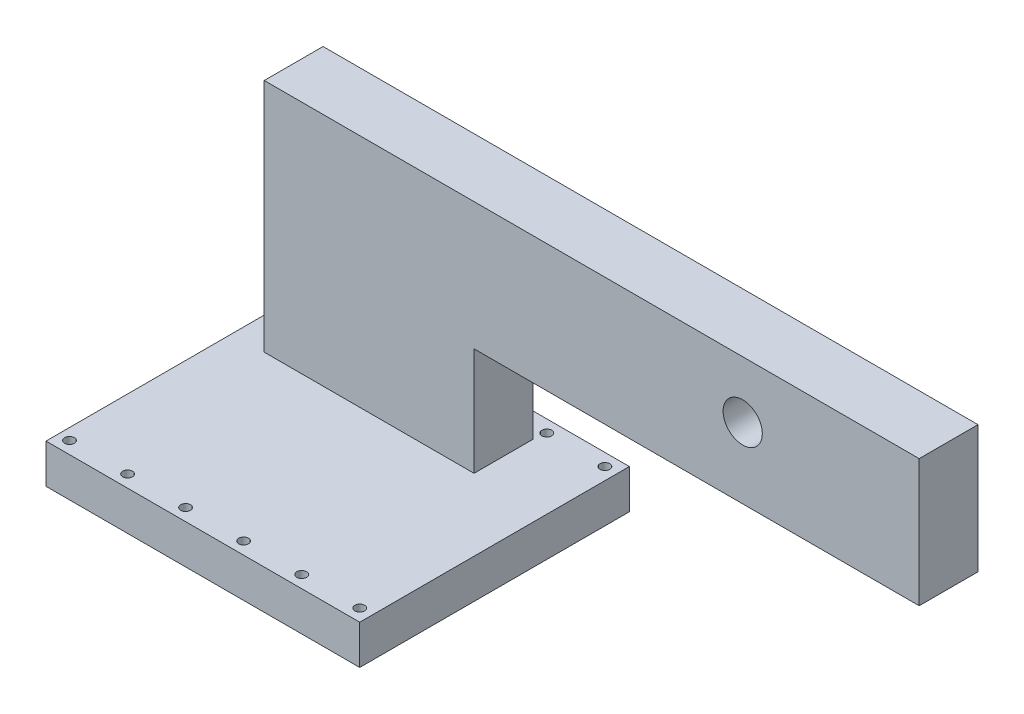
ISO-10303-21;
HEADER;
FILE_DESCRIPTION(('STEP AP214'),'2;1');
FILE_NAME('part.step','',(''),(''),'','','');
FILE_SCHEMA(('AUTOMOTIVE_DESIGN { 1 0 10303 214 1 1 1 1 }'));
ENDSEC;
DATA;
#1=APPLICATION_CONTEXT('core data for automotive mechanical design processes');
#2=APPLICATION_PROTOCOL_DEFINITION('international standard','automotive_design',2000,#1);
#3=PRODUCT_CONTEXT('',#1,'mechanical');
#4=PRODUCT('Part','Part','',(#3));
#5=PRODUCT_RELATED_PRODUCT_CATEGORY('part','',(#4));
#6=PRODUCT_DEFINITION_FORMATION('','',#4);
#7=PRODUCT_DEFINITION_CONTEXT('part definition',#1,'design');
#8=PRODUCT_DEFINITION('design','',#6,#7);
#9=PRODUCT_DEFINITION_SHAPE('','',#8);
#10=(LENGTH_UNIT() NAMED_UNIT(*) SI_UNIT(.MILLI.,.METRE.));
#11=(NAMED_UNIT(*) PLANE_ANGLE_UNIT() SI_UNIT($,.RADIAN.));
#12=(NAMED_UNIT(*) SI_UNIT($,.STERADIAN.) SOLID_ANGLE_UNIT());
#13=UNCERTAINTY_MEASURE_WITH_UNIT(LENGTH_MEASURE(1.E-05),#10,'distance_accuracy_value','');
#14=(GEOMETRIC_REPRESENTATION_CONTEXT(3) GLOBAL_UNCERTAINTY_ASSIGNED_CONTEXT((#13)) GLOBAL_UNIT_ASSIGNED_CONTEXT((#10,
#11,#12)) REPRESENTATION_CONTEXT('',''));
#15=CARTESIAN_POINT('',(0.,0.,0.));
#16=DIRECTION('',(0.,0.,1.));
#17=DIRECTION('',(1.,0.,0.));
#18=AXIS2_PLACEMENT_3D('',#15,#16,#17);
#19=CARTESIAN_POINT('',(0.,-25.4,0.));
#20=DIRECTION('',(0.,-1.,0.));
#21=DIRECTION('',(1.,0.,0.));
#22=AXIS2_PLACEMENT_3D('',#19,#20,#21);
#23=PLANE('',#22);
#24=CARTESIAN_POINT('',(24.0665,-25.4,-27.1145000000011));
#25=DIRECTION('',(0.,-1.,0.));
#26=DIRECTION('',(1.,0.,0.));
#27=AXIS2_PLACEMENT_3D('',#24,#25,#26);
#28=CIRCLE('',#27,3.175);
#29=CARTESIAN_POINT('',(27.2415,-25.4,-27.1145000000011));
#30=VERTEX_POINT('',#29);
#31=EDGE_CURVE('E179',#30,#30,#28,.T.);
#32=ORIENTED_EDGE('',*,*,#31,.F.);
#33=EDGE_LOOP('',(#32));
#34=FACE_BOUND('',#33,.T.);
#35=CARTESIAN_POINT('',(99.2505,-25.4,-27.1145000000005));
#36=DIRECTION('',(0.,-1.,0.));
#37=DIRECTION('',(1.,0.,0.));
#38=AXIS2_PLACEMENT_3D('',#35,#36,#37);
#39=CIRCLE('',#38,3.175);
#40=CARTESIAN_POINT('',(102.4255,-25.4,-27.1145000000005));
#41=VERTEX_POINT('',#40);
#42=EDGE_CURVE('E167',#41,#41,#39,.T.);
#43=ORIENTED_EDGE('',*,*,#42,.F.);
#44=EDGE_LOOP('',(#43));
#45=FACE_BOUND('',#44,.T.);
#46=CARTESIAN_POINT('',(-13.5255,-25.4,131.635499999999));
#47=DIRECTION('',(0.,-1.,0.));
#48=DIRECTION('',(1.,0.,0.));
#49=AXIS2_PLACEMENT_3D('',#46,#47,#48);
#50=CIRCLE('',#49,3.17499999999997);
#51=CARTESIAN_POINT('',(-10.3505000000001,-25.4,131.635499999999));
#52=VERTEX_POINT('',#51);
#53=EDGE_CURVE('E155',#52,#52,#50,.T.);
#54=ORIENTED_EDGE('',*,*,#53,.F.);
#55=EDGE_LOOP('',(#54));
#56=FACE_BOUND('',#55,.T.);
#57=CARTESIAN_POINT('',(61.6585,-25.4,131.635499999999));
#58=DIRECTION('',(0.,-1.,0.));
#59=DIRECTION('',(1.,0.,0.));
#60=AXIS2_PLACEMENT_3D('',#57,#58,#59);
#61=CIRCLE('',#60,3.17499999999997);
#62=CARTESIAN_POINT('',(64.8335,-25.4,131.635499999999));
#63=VERTEX_POINT('',#62);
#64=EDGE_CURVE('E143',#63,#63,#61,.T.);
#65=ORIENTED_EDGE('',*,*,#64,.F.);
#66=EDGE_LOOP('',(#65));
#67=FACE_BOUND('',#66,.T.);
#68=CARTESIAN_POINT('',(136.8425,-25.4,131.6355));
#69=DIRECTION('',(0.,-1.,0.));
#70=DIRECTION('',(1.,0.,0.));
#71=AXIS2_PLACEMENT_3D('',#68,#69,#70);
#72=CIRCLE('',#71,3.17499999999997);
#73=CARTESIAN_POINT('',(140.0175,-25.4,131.6355));
#74=VERTEX_POINT('',#73);
#75=EDGE_CURVE('E131',#74,#74,#72,.T.);
#76=ORIENTED_EDGE('',*,*,#75,.F.);
#77=EDGE_LOOP('',(#76));
#78=FACE_BOUND('',#77,.T.);
#79=CARTESIAN_POINT('',(174.4345,-25.4,131.6355));
#80=DIRECTION('',(0.,-1.,0.));
#81=DIRECTION('',(1.,0.,0.));
#82=AXIS2_PLACEMENT_3D('',#79,#80,#81);
#83=CIRCLE('',#82,3.17499999999997);
#84=CARTESIAN_POINT('',(177.6095,-25.4,131.6355));
#85=VERTEX_POINT('',#84);
#86=EDGE_CURVE('E110',#85,#85,#83,.T.);
#87=ORIENTED_EDGE('',*,*,#86,.F.);
#88=EDGE_LOOP('',(#87));
#89=FACE_BOUND('',#88,.T.);
#90=DIRECTION('',(0.,0.,-1.));
#91=VECTOR('',#90,1.);
#92=CARTESIAN_POINT('',(-20.828,-25.4,139.573));
#93=LINE('',#92,#91);
#94=CARTESIAN_POINT('',(-20.828,-25.4,139.573));
#95=VERTEX_POINT('',#94);
#96=CARTESIAN_POINT('',(-20.828,-25.4,-35.052));
#97=VERTEX_POINT('',#96);
#98=EDGE_CURVE('E95',#95,#97,#93,.T.);
#99=ORIENTED_EDGE('',*,*,#98,.T.);
#100=DIRECTION('',(1.,0.,0.));
#101=VECTOR('',#100,1.);
#102=CARTESIAN_POINT('',(-20.828,-25.4,-35.052));
#103=LINE('',#102,#101);
#104=CARTESIAN_POINT('',(182.372,-25.4,-35.052));
#105=VERTEX_POINT('',#104);
#106=EDGE_CURVE('E90',#97,#105,#103,.T.);
#107=ORIENTED_EDGE('',*,*,#106,.T.);
#108=DIRECTION('',(0.,0.,1.));
#109=VECTOR('',#108,1.);
#110=CARTESIAN_POINT('',(182.372,-25.4,139.573));
#111=LINE('',#110,#109);
#112=CARTESIAN_POINT('',(182.372,-25.4,139.573));
#113=VERTEX_POINT('',#112);
#114=EDGE_CURVE('E93',#105,#113,#111,.T.);
#115=ORIENTED_EDGE('',*,*,#114,.T.);
#116=DIRECTION('',(-1.,0.,0.));
#117=VECTOR('',#116,1.);
#118=CARTESIAN_POINT('',(-20.828,-25.4,139.573));
#119=LINE('',#118,#117);
#120=EDGE_CURVE('E60',#113,#95,#119,.T.);
#121=ORIENTED_EDGE('',*,*,#120,.T.);
#122=EDGE_LOOP('',(#99,#107,#115,#121));
#123=FACE_BOUND('',#122,.T.);
#124=CARTESIAN_POINT('',(174.4345,-25.4,-27.1145));
#125=DIRECTION('',(0.,-1.,0.));
#126=DIRECTION('',(1.,0.,0.));
#127=AXIS2_PLACEMENT_3D('',#124,#125,#126);
#128=CIRCLE('',#127,3.175);
#129=CARTESIAN_POINT('',(177.6095,-25.4,-27.1145));
#130=VERTEX_POINT('',#129);
#131=EDGE_CURVE('E125',#130,#130,#128,.T.);
#132=ORIENTED_EDGE('',*,*,#131,.F.);
#133=EDGE_LOOP('',(#132));
#134=FACE_BOUND('',#133,.T.);
#135=CARTESIAN_POINT('',(99.2505,-25.4,131.635499999999));
#136=DIRECTION('',(0.,-1.,0.));
#137=DIRECTION('',(1.,0.,0.));
#138=AXIS2_PLACEMENT_3D('',#135,#136,#137);
#139=CIRCLE('',#138,3.17499999999997);
#140=CARTESIAN_POINT('',(102.4255,-25.4,131.635499999999));
#141=VERTEX_POINT('',#140);
#142=EDGE_CURVE('E137',#141,#141,#139,.T.);
#143=ORIENTED_EDGE('',*,*,#142,.F.);
#144=EDGE_LOOP('',(#143));
#145=FACE_BOUND('',#144,.T.);
#146=CARTESIAN_POINT('',(24.0665,-25.4,131.635499999999));
#147=DIRECTION('',(0.,-1.,0.));
#148=DIRECTION('',(1.,0.,0.));
#149=AXIS2_PLACEMENT_3D('',#146,#147,#148);
#150=CIRCLE('',#149,3.17499999999997);
#151=CARTESIAN_POINT('',(27.2415,-25.4,131.635499999999));
#152=VERTEX_POINT('',#151);
#153=EDGE_CURVE('E149',#152,#152,#150,.T.);
#154=ORIENTED_EDGE('',*,*,#153,.F.);
#155=EDGE_LOOP('',(#154));
#156=FACE_BOUND('',#155,.T.);
#157=CARTESIAN_POINT('',(136.8425,-25.4,-27.1145000000003));
#158=DIRECTION('',(0.,-1.,0.));
#159=DIRECTION('',(1.,0.,0.));
#160=AXIS2_PLACEMENT_3D('',#157,#158,#159);
#161=CIRCLE('',#160,3.17500000000003);
#162=CARTESIAN_POINT('',(140.0175,-25.4,-27.1145000000003));
#163=VERTEX_POINT('',#162);
#164=EDGE_CURVE('E161',#163,#163,#161,.T.);
#165=ORIENTED_EDGE('',*,*,#164,.F.);
#166=EDGE_LOOP('',(#165));
#167=FACE_BOUND('',#166,.T.);
#168=CARTESIAN_POINT('',(61.6585,-25.4,-27.1145000000008));
#169=DIRECTION('',(0.,-1.,0.));
#170=DIRECTION('',(1.,0.,0.));
#171=AXIS2_PLACEMENT_3D('',#168,#169,#170);
#172=CIRCLE('',#171,3.175);
#173=CARTESIAN_POINT('',(64.8335,-25.4,-27.1145000000008));
#174=VERTEX_POINT('',#173);
#175=EDGE_CURVE('E173',#174,#174,#172,.T.);
#176=ORIENTED_EDGE('',*,*,#175,.F.);
#177=EDGE_LOOP('',(#176));
#178=FACE_BOUND('',#177,.T.);
#179=CARTESIAN_POINT('',(-13.5255,-25.4,-27.1145000000013));
#180=DIRECTION('',(0.,-1.,0.));
#181=DIRECTION('',(1.,0.,0.));
#182=AXIS2_PLACEMENT_3D('',#179,#180,#181);
#183=CIRCLE('',#182,3.175);
#184=CARTESIAN_POINT('',(-10.3505,-25.4,-27.1145000000013));
#185=VERTEX_POINT('',#184);
#186=EDGE_CURVE('E185',#185,#185,#183,.T.);
#187=ORIENTED_EDGE('',*,*,#186,.F.);
#188=EDGE_LOOP('',(#187));
#189=FACE_BOUND('',#188,.T.);
#190=ADVANCED_FACE('F43',(#34,#45,#56,#67,#78,#89,#123,#134,#145,#156,#167,#178,#189),#23,.T.);
#191=CARTESIAN_POINT('',(0.,0.,0.));
#192=DIRECTION('',(0.,-1.,0.));
#193=DIRECTION('',(1.,0.,0.));
#194=AXIS2_PLACEMENT_3D('',#191,#192,#193);
#195=PLANE('',#194);
#196=DIRECTION('',(0.,0.,-1.));
#197=VECTOR('',#196,1.);
#198=CARTESIAN_POINT('',(-20.828,0.,139.573));
#199=LINE('',#198,#197);
#200=CARTESIAN_POINT('',(-20.828,0.,139.573));
#201=VERTEX_POINT('',#200);
#202=CARTESIAN_POINT('',(-20.828,0.,-35.052));
#203=VERTEX_POINT('',#202);
#204=EDGE_CURVE('E107',#201,#203,#199,.T.);
#205=ORIENTED_EDGE('',*,*,#204,.F.);
#206=DIRECTION('',(-1.,0.,0.));
#207=VECTOR('',#206,1.);
#208=CARTESIAN_POINT('',(-20.828,0.,139.573));
#209=LINE('',#208,#207);
#210=CARTESIAN_POINT('',(182.372,0.,139.573));
#211=VERTEX_POINT('',#210);
#212=EDGE_CURVE('E83',#211,#201,#209,.T.);
#213=ORIENTED_EDGE('',*,*,#212,.F.);
#214=DIRECTION('',(0.,0.,1.));
#215=VECTOR('',#214,1.);
#216=CARTESIAN_POINT('',(182.372,0.,139.573));
#217=LINE('',#216,#215);
#218=CARTESIAN_POINT('',(182.372,0.,-35.052));
#219=VERTEX_POINT('',#218);
#220=EDGE_CURVE('E77',#219,#211,#217,.T.);
#221=ORIENTED_EDGE('',*,*,#220,.F.);
#222=DIRECTION('',(1.,0.,0.));
#223=VECTOR('',#222,1.);
#224=CARTESIAN_POINT('',(-20.828,0.,-35.052));
#225=LINE('',#224,#223);
#226=EDGE_CURVE('E99',#203,#219,#225,.T.);
#227=ORIENTED_EDGE('',*,*,#226,.F.);
#228=EDGE_LOOP('',(#205,#213,#221,#227));
#229=FACE_BOUND('',#228,.T.);
#230=CARTESIAN_POINT('',(174.4345,0.,131.6355));
#231=DIRECTION('',(0.,-1.,0.));
#232=DIRECTION('',(1.,0.,0.));
#233=AXIS2_PLACEMENT_3D('',#230,#231,#232);
#234=CIRCLE('',#233,3.17499999999997);
#235=CARTESIAN_POINT('',(177.6095,0.,131.6355));
#236=VERTEX_POINT('',#235);
#237=EDGE_CURVE('E122',#236,#236,#234,.T.);
#238=ORIENTED_EDGE('',*,*,#237,.T.);
#239=EDGE_LOOP('',(#238));
#240=FACE_BOUND('',#239,.T.);
#241=CARTESIAN_POINT('',(174.4345,0.,-27.1145));
#242=DIRECTION('',(0.,-1.,0.));
#243=DIRECTION('',(1.,0.,0.));
#244=AXIS2_PLACEMENT_3D('',#241,#242,#243);
#245=CIRCLE('',#244,3.175);
#246=CARTESIAN_POINT('',(177.6095,0.,-27.1145));
#247=VERTEX_POINT('',#246);
#248=EDGE_CURVE('E128',#247,#247,#245,.T.);
#249=ORIENTED_EDGE('',*,*,#248,.T.);
#250=EDGE_LOOP('',(#249));
#251=FACE_BOUND('',#250,.T.);
#252=CARTESIAN_POINT('',(136.8425,0.,131.6355));
#253=DIRECTION('',(0.,-1.,0.));
#254=DIRECTION('',(1.,0.,0.));
#255=AXIS2_PLACEMENT_3D('',#252,#253,#254);
#256=CIRCLE('',#255,3.17499999999997);
#257=CARTESIAN_POINT('',(140.0175,0.,131.6355));
#258=VERTEX_POINT('',#257);
#259=EDGE_CURVE('E134',#258,#258,#256,.T.);
#260=ORIENTED_EDGE('',*,*,#259,.T.);
#261=EDGE_LOOP('',(#260));
#262=FACE_BOUND('',#261,.T.);
#263=CARTESIAN_POINT('',(99.2505,0.,131.635499999999));
#264=DIRECTION('',(0.,-1.,0.));
#265=DIRECTION('',(1.,0.,0.));
#266=AXIS2_PLACEMENT_3D('',#263,#264,#265);
#267=CIRCLE('',#266,3.17499999999997);
#268=CARTESIAN_POINT('',(102.4255,0.,131.635499999999));
#269=VERTEX_POINT('',#268);
#270=EDGE_CURVE('E140',#269,#269,#267,.T.);
#271=ORIENTED_EDGE('',*,*,#270,.T.);
#272=EDGE_LOOP('',(#271));
#273=FACE_BOUND('',#272,.T.);
#274=CARTESIAN_POINT('',(61.6585,0.,131.635499999999));
#275=DIRECTION('',(0.,-1.,0.));
#276=DIRECTION('',(1.,0.,0.));
#277=AXIS2_PLACEMENT_3D('',#274,#275,#276);
#278=CIRCLE('',#277,3.17499999999997);
#279=CARTESIAN_POINT('',(64.8335,0.,131.635499999999));
#280=VERTEX_POINT('',#279);
#281=EDGE_CURVE('E146',#280,#280,#278,.T.);
#282=ORIENTED_EDGE('',*,*,#281,.T.);
#283=EDGE_LOOP('',(#282));
#284=FACE_BOUND('',#283,.T.);
#285=CARTESIAN_POINT('',(24.0665,0.,131.635499999999));
#286=DIRECTION('',(0.,-1.,0.));
#287=DIRECTION('',(1.,0.,0.));
#288=AXIS2_PLACEMENT_3D('',#285,#286,#287);
#289=CIRCLE('',#288,3.17499999999997);
#290=CARTESIAN_POINT('',(27.2415,0.,131.635499999999));
#291=VERTEX_POINT('',#290);
#292=EDGE_CURVE('E152',#291,#291,#289,.T.);
#293=ORIENTED_EDGE('',*,*,#292,.T.);
#294=EDGE_LOOP('',(#293));
#295=FACE_BOUND('',#294,.T.);
#296=CARTESIAN_POINT('',(-13.5255,0.,131.635499999999));
#297=DIRECTION('',(0.,-1.,0.));
#298=DIRECTION('',(1.,0.,0.));
#299=AXIS2_PLACEMENT_3D('',#296,#297,#298);
#300=CIRCLE('',#299,3.17499999999997);
#301=CARTESIAN_POINT('',(-10.3505000000001,0.,131.635499999999));
#302=VERTEX_POINT('',#301);
#303=EDGE_CURVE('E158',#302,#302,#300,.T.);
#304=ORIENTED_EDGE('',*,*,#303,.T.);
#305=EDGE_LOOP('',(#304));
#306=FACE_BOUND('',#305,.T.);
#307=CARTESIAN_POINT('',(136.8425,0.,-27.1145000000003));
#308=DIRECTION('',(0.,-1.,0.));
#309=DIRECTION('',(1.,0.,0.));
#310=AXIS2_PLACEMENT_3D('',#307,#308,#309);
#311=CIRCLE('',#310,3.17500000000003);
#312=CARTESIAN_POINT('',(140.0175,0.,-27.1145000000003));
#313=VERTEX_POINT('',#312);
#314=EDGE_CURVE('E164',#313,#313,#311,.T.);
#315=ORIENTED_EDGE('',*,*,#314,.T.);
#316=EDGE_LOOP('',(#315));
#317=FACE_BOUND('',#316,.T.);
#318=CARTESIAN_POINT('',(99.2505,0.,-27.1145000000005));
#319=DIRECTION('',(0.,-1.,0.));
#320=DIRECTION('',(1.,0.,0.));
#321=AXIS2_PLACEMENT_3D('',#318,#319,#320);
#322=CIRCLE('',#321,3.175);
#323=CARTESIAN_POINT('',(102.4255,0.,-27.1145000000005));
#324=VERTEX_POINT('',#323);
#325=EDGE_CURVE('E170',#324,#324,#322,.T.);
#326=ORIENTED_EDGE('',*,*,#325,.T.);
#327=EDGE_LOOP('',(#326));
#328=FACE_BOUND('',#327,.T.);
#329=CARTESIAN_POINT('',(61.6585,0.,-27.1145000000008));
#330=DIRECTION('',(0.,-1.,0.));
#331=DIRECTION('',(1.,0.,0.));
#332=AXIS2_PLACEMENT_3D('',#329,#330,#331);
#333=CIRCLE('',#332,3.175);
#334=CARTESIAN_POINT('',(64.8335,0.,-27.1145000000008));
#335=VERTEX_POINT('',#334);
#336=EDGE_CURVE('E176',#335,#335,#333,.T.);
#337=ORIENTED_EDGE('',*,*,#336,.T.);
#338=EDGE_LOOP('',(#337));
#339=FACE_BOUND('',#338,.T.);
#340=CARTESIAN_POINT('',(24.0665,0.,-27.1145000000011));
#341=DIRECTION('',(0.,-1.,0.));
#342=DIRECTION('',(1.,0.,0.));
#343=AXIS2_PLACEMENT_3D('',#340,#341,#342);
#344=CIRCLE('',#343,3.175);
#345=CARTESIAN_POINT('',(27.2415,0.,-27.1145000000011));
#346=VERTEX_POINT('',#345);
#347=EDGE_CURVE('E182',#346,#346,#344,.T.);
#348=ORIENTED_EDGE('',*,*,#347,.T.);
#349=EDGE_LOOP('',(#348));
#350=FACE_BOUND('',#349,.T.);
#351=CARTESIAN_POINT('',(-13.5255,0.,-27.1145000000013));
#352=DIRECTION('',(0.,-1.,0.));
#353=DIRECTION('',(1.,0.,0.));
#354=AXIS2_PLACEMENT_3D('',#351,#352,#353);
#355=CIRCLE('',#354,3.175);
#356=CARTESIAN_POINT('',(-10.3505,0.,-27.1145000000013));
#357=VERTEX_POINT('',#356);
#358=EDGE_CURVE('E188',#357,#357,#355,.T.);
#359=ORIENTED_EDGE('',*,*,#358,.T.);
#360=EDGE_LOOP('',(#359));
#361=FACE_BOUND('',#360,.T.);
#362=ADVANCED_FACE('F118',(#229,#240,#251,#262,#273,#284,#295,#306,#317,#328,#339,#350,#361),
#195,.F.);
#363=CARTESIAN_POINT('',(-20.828,-25.4,139.573));
#364=DIRECTION('',(1.,0.,0.));
#365=DIRECTION('',(0.,0.,-1.));
#366=AXIS2_PLACEMENT_3D('',#363,#364,#365);
#367=PLANE('',#366);
#368=ORIENTED_EDGE('',*,*,#204,.T.);
#369=DIRECTION('',(0.,1.,0.));
#370=VECTOR('',#369,1.);
#371=CARTESIAN_POINT('',(-20.828,-25.4,-35.052));
#372=LINE('',#371,#370);
#373=EDGE_CURVE('E12',#97,#203,#372,.T.);
#374=ORIENTED_EDGE('',*,*,#373,.F.);
#375=ORIENTED_EDGE('',*,*,#98,.F.);
#376=DIRECTION('',(0.,1.,0.));
#377=VECTOR('',#376,1.);
#378=CARTESIAN_POINT('',(-20.828,-25.4,139.573));
#379=LINE('',#378,#377);
#380=EDGE_CURVE('E103',#95,#201,#379,.T.);
#381=ORIENTED_EDGE('',*,*,#380,.T.);
#382=EDGE_LOOP('',(#368,#374,#375,#381));
#383=FACE_BOUND('',#382,.T.);
#384=ADVANCED_FACE('F45',(#383),#367,.F.);
#385=CARTESIAN_POINT('',(-20.828,-25.4,-35.052));
#386=DIRECTION('',(0.,0.,1.));
#387=DIRECTION('',(1.,0.,0.));
#388=AXIS2_PLACEMENT_3D('',#385,#386,#387);
#389=PLANE('',#388);
#390=ORIENTED_EDGE('',*,*,#226,.T.);
#391=DIRECTION('',(0.,1.,0.));
#392=VECTOR('',#391,1.);
#393=CARTESIAN_POINT('',(182.372,-25.4,-35.052));
#394=LINE('',#393,#392);
#395=EDGE_CURVE('E52',#105,#219,#394,.T.);
#396=ORIENTED_EDGE('',*,*,#395,.F.);
#397=ORIENTED_EDGE('',*,*,#106,.F.);
#398=ORIENTED_EDGE('',*,*,#373,.T.);
#399=EDGE_LOOP('',(#390,#396,#397,#398));
#400=FACE_BOUND('',#399,.T.);
#401=ADVANCED_FACE('F98',(#400),#389,.F.);
#402=CARTESIAN_POINT('',(182.372,-25.4,139.573));
#403=DIRECTION('',(-1.,0.,0.));
#404=DIRECTION('',(0.,0.,1.));
#405=AXIS2_PLACEMENT_3D('',#402,#403,#404);
#406=PLANE('',#405);
#407=ORIENTED_EDGE('',*,*,#220,.T.);
#408=DIRECTION('',(0.,1.,0.));
#409=VECTOR('',#408,1.);
#410=CARTESIAN_POINT('',(182.372,-25.4,139.573));
#411=LINE('',#410,#409);
#412=EDGE_CURVE('E100',#113,#211,#411,.T.);
#413=ORIENTED_EDGE('',*,*,#412,.F.);
#414=ORIENTED_EDGE('',*,*,#114,.F.);
#415=ORIENTED_EDGE('',*,*,#395,.T.);
#416=EDGE_LOOP('',(#407,#413,#414,#415));
#417=FACE_BOUND('',#416,.T.);
#418=ADVANCED_FACE('F101',(#417),#406,.F.);
#419=CARTESIAN_POINT('',(-20.828,-25.4,139.573));
#420=DIRECTION('',(0.,0.,-1.));
#421=DIRECTION('',(-1.,0.,0.));
#422=AXIS2_PLACEMENT_3D('',#419,#420,#421);
#423=PLANE('',#422);
#424=ORIENTED_EDGE('',*,*,#212,.T.);
#425=ORIENTED_EDGE('',*,*,#380,.F.);
#426=ORIENTED_EDGE('',*,*,#120,.F.);
#427=ORIENTED_EDGE('',*,*,#412,.T.);
#428=EDGE_LOOP('',(#424,#425,#426,#427));
#429=FACE_BOUND('',#428,.T.);
#430=ADVANCED_FACE('F115',(#429),#423,.F.);
#431=CARTESIAN_POINT('',(174.4345,-25.4,131.6355));
#432=DIRECTION('',(0.,1.,0.));
#433=DIRECTION('',(-1.,0.,0.));
#434=AXIS2_PLACEMENT_3D('',#431,#432,#433);
#435=CYLINDRICAL_SURFACE('',#434,3.17499999999997);
#436=ORIENTED_EDGE('',*,*,#86,.T.);
#437=EDGE_LOOP('',(#436));
#438=FACE_BOUND('',#437,.T.);
#439=ORIENTED_EDGE('',*,*,#237,.F.);
#440=EDGE_LOOP('',(#439));
#441=FACE_BOUND('',#440,.T.);
#442=ADVANCED_FACE('F207',(#438,#441),#435,.F.);
#443=CARTESIAN_POINT('',(174.4345,-25.4,-27.1145));
#444=DIRECTION('',(0.,1.,0.));
#445=DIRECTION('',(-1.,0.,0.));
#446=AXIS2_PLACEMENT_3D('',#443,#444,#445);
#447=CYLINDRICAL_SURFACE('',#446,3.175);
#448=ORIENTED_EDGE('',*,*,#131,.T.);
#449=EDGE_LOOP('',(#448));
#450=FACE_BOUND('',#449,.T.);
#451=ORIENTED_EDGE('',*,*,#248,.F.);
#452=EDGE_LOOP('',(#451));
#453=FACE_BOUND('',#452,.T.);
#454=ADVANCED_FACE('F253',(#450,#453),#447,.F.);
#455=CARTESIAN_POINT('',(136.8425,-25.4,131.6355));
#456=DIRECTION('',(0.,1.,0.));
#457=DIRECTION('',(-1.,0.,0.));
#458=AXIS2_PLACEMENT_3D('',#455,#456,#457);
#459=CYLINDRICAL_SURFACE('',#458,3.17499999999997);
#460=ORIENTED_EDGE('',*,*,#75,.T.);
#461=EDGE_LOOP('',(#460));
#462=FACE_BOUND('',#461,.T.);
#463=ORIENTED_EDGE('',*,*,#259,.F.);
#464=EDGE_LOOP('',(#463));
#465=FACE_BOUND('',#464,.T.);
#466=ADVANCED_FACE('F261',(#462,#465),#459,.F.);
#467=CARTESIAN_POINT('',(99.2505,-25.4,131.635499999999));
#468=DIRECTION('',(0.,1.,0.));
#469=DIRECTION('',(-1.,0.,0.));
#470=AXIS2_PLACEMENT_3D('',#467,#468,#469);
#471=CYLINDRICAL_SURFACE('',#470,3.17499999999997);
#472=ORIENTED_EDGE('',*,*,#142,.T.);
#473=EDGE_LOOP('',(#472));
#474=FACE_BOUND('',#473,.T.);
#475=ORIENTED_EDGE('',*,*,#270,.F.);
#476=EDGE_LOOP('',(#475));
#477=FACE_BOUND('',#476,.T.);
#478=ADVANCED_FACE('F269',(#474,#477),#471,.F.);
#479=CARTESIAN_POINT('',(61.6585,-25.4,131.635499999999));
#480=DIRECTION('',(0.,1.,0.));
#481=DIRECTION('',(-1.,0.,0.));
#482=AXIS2_PLACEMENT_3D('',#479,#480,#481);
#483=CYLINDRICAL_SURFACE('',#482,3.17499999999997);
#484=ORIENTED_EDGE('',*,*,#64,.T.);
#485=EDGE_LOOP('',(#484));
#486=FACE_BOUND('',#485,.T.);
#487=ORIENTED_EDGE('',*,*,#281,.F.);
#488=EDGE_LOOP('',(#487));
#489=FACE_BOUND('',#488,.T.);
#490=ADVANCED_FACE('F278',(#486,#489),#483,.F.);
#491=CARTESIAN_POINT('',(24.0665,-25.4,131.635499999999));
#492=DIRECTION('',(0.,1.,0.));
#493=DIRECTION('',(-1.,0.,0.));
#494=AXIS2_PLACEMENT_3D('',#491,#492,#493);
#495=CYLINDRICAL_SURFACE('',#494,3.17499999999997);
#496=ORIENTED_EDGE('',*,*,#153,.T.);
#497=EDGE_LOOP('',(#496));
#498=FACE_BOUND('',#497,.T.);
#499=ORIENTED_EDGE('',*,*,#292,.F.);
#500=EDGE_LOOP('',(#499));
#501=FACE_BOUND('',#500,.T.);
#502=ADVANCED_FACE('F287',(#498,#501),#495,.F.);
#503=CARTESIAN_POINT('',(-13.5255,-25.4,131.635499999999));
#504=DIRECTION('',(0.,1.,0.));
#505=DIRECTION('',(-1.,0.,0.));
#506=AXIS2_PLACEMENT_3D('',#503,#504,#505);
#507=CYLINDRICAL_SURFACE('',#506,3.17499999999997);
#508=ORIENTED_EDGE('',*,*,#53,.T.);
#509=EDGE_LOOP('',(#508));
#510=FACE_BOUND('',#509,.T.);
#511=ORIENTED_EDGE('',*,*,#303,.F.);
#512=EDGE_LOOP('',(#511));
#513=FACE_BOUND('',#512,.T.);
#514=ADVANCED_FACE('F296',(#510,#513),#507,.F.);
#515=CARTESIAN_POINT('',(136.8425,-25.4,-27.1145000000003));
#516=DIRECTION('',(0.,1.,0.));
#517=DIRECTION('',(-1.,0.,0.));
#518=AXIS2_PLACEMENT_3D('',#515,#516,#517);
#519=CYLINDRICAL_SURFACE('',#518,3.17500000000003);
#520=ORIENTED_EDGE('',*,*,#164,.T.);
#521=EDGE_LOOP('',(#520));
#522=FACE_BOUND('',#521,.T.);
#523=ORIENTED_EDGE('',*,*,#314,.F.);
#524=EDGE_LOOP('',(#523));
#525=FACE_BOUND('',#524,.T.);
#526=ADVANCED_FACE('F305',(#522,#525),#519,.F.);
#527=CARTESIAN_POINT('',(99.2505,-25.4,-27.1145000000005));
#528=DIRECTION('',(0.,1.,0.));
#529=DIRECTION('',(-1.,0.,0.));
#530=AXIS2_PLACEMENT_3D('',#527,#528,#529);
#531=CYLINDRICAL_SURFACE('',#530,3.175);
#532=ORIENTED_EDGE('',*,*,#42,.T.);
#533=EDGE_LOOP('',(#532));
#534=FACE_BOUND('',#533,.T.);
#535=ORIENTED_EDGE('',*,*,#325,.F.);
#536=EDGE_LOOP('',(#535));
#537=FACE_BOUND('',#536,.T.);
#538=ADVANCED_FACE('F314',(#534,#537),#531,.F.);
#539=CARTESIAN_POINT('',(61.6585,-25.4,-27.1145000000008));
#540=DIRECTION('',(0.,1.,0.));
#541=DIRECTION('',(-1.,0.,0.));
#542=AXIS2_PLACEMENT_3D('',#539,#540,#541);
#543=CYLINDRICAL_SURFACE('',#542,3.175);
#544=ORIENTED_EDGE('',*,*,#175,.T.);
#545=EDGE_LOOP('',(#544));
#546=FACE_BOUND('',#545,.T.);
#547=ORIENTED_EDGE('',*,*,#336,.F.);
#548=EDGE_LOOP('',(#547));
#549=FACE_BOUND('',#548,.T.);
#550=ADVANCED_FACE('F323',(#546,#549),#543,.F.);
#551=CARTESIAN_POINT('',(24.0665,-25.4,-27.1145000000011));
#552=DIRECTION('',(0.,1.,0.));
#553=DIRECTION('',(-1.,0.,0.));
#554=AXIS2_PLACEMENT_3D('',#551,#552,#553);
#555=CYLINDRICAL_SURFACE('',#554,3.175);
#556=ORIENTED_EDGE('',*,*,#31,.T.);
#557=EDGE_LOOP('',(#556));
#558=FACE_BOUND('',#557,.T.);
#559=ORIENTED_EDGE('',*,*,#347,.F.);
#560=EDGE_LOOP('',(#559));
#561=FACE_BOUND('',#560,.T.);
#562=ADVANCED_FACE('F332',(#558,#561),#555,.F.);
#563=CARTESIAN_POINT('',(-13.5255,-25.4,-27.1145000000013));
#564=DIRECTION('',(0.,1.,0.));
#565=DIRECTION('',(-1.,0.,0.));
#566=AXIS2_PLACEMENT_3D('',#563,#564,#565);
#567=CYLINDRICAL_SURFACE('',#566,3.175);
#568=ORIENTED_EDGE('',*,*,#186,.T.);
#569=EDGE_LOOP('',(#568));
#570=FACE_BOUND('',#569,.T.);
#571=ORIENTED_EDGE('',*,*,#358,.F.);
#572=EDGE_LOOP('',(#571));
#573=FACE_BOUND('',#572,.T.);
#574=ADVANCED_FACE('F194',(#570,#573),#567,.F.);
#575=CLOSED_SHELL('',(#190,#362,#384,#401,#418,#430,#442,#454,#466,#478,#490,#502,#514,#526,
#538,#550,#562,#574));
#576=MANIFOLD_SOLID_BREP('B2',#575);
#577=CARTESIAN_POINT('',(135.89,0.,19.05));
#578=DIRECTION('',(0.,1.,0.));
#579=DIRECTION('',(-1.,0.,0.));
#580=AXIS2_PLACEMENT_3D('',#577,#578,#579);
#581=PLANE('',#580);
#582=DIRECTION('',(1.,0.,0.));
#583=VECTOR('',#582,1.);
#584=CARTESIAN_POINT('',(135.89,0.,-19.05));
#585=LINE('',#584,#583);
#586=CARTESIAN_POINT('',(0.,0.,-19.05));
#587=VERTEX_POINT('',#586);
#588=CARTESIAN_POINT('',(135.89,0.,-19.05));
#589=VERTEX_POINT('',#588);
#590=EDGE_CURVE('E502',#587,#589,#585,.T.);
#591=ORIENTED_EDGE('',*,*,#590,.T.);
#592=DIRECTION('',(0.,0.,-1.));
#593=VECTOR('',#592,1.);
#594=CARTESIAN_POINT('',(135.89,0.,19.05));
#595=LINE('',#594,#593);
#596=CARTESIAN_POINT('',(135.89,0.,19.05));
#597=VERTEX_POINT('',#596);
#598=EDGE_CURVE('E41',#597,#589,#595,.T.);
#599=ORIENTED_EDGE('',*,*,#598,.F.);
#600=DIRECTION('',(1.,0.,0.));
#601=VECTOR('',#600,1.);
#602=CARTESIAN_POINT('',(135.89,0.,19.05));
#603=LINE('',#602,#601);
#604=CARTESIAN_POINT('',(0.,0.,19.05));
#605=VERTEX_POINT('',#604);
#606=EDGE_CURVE('E513',#605,#597,#603,.T.);
#607=ORIENTED_EDGE('',*,*,#606,.F.);
#608=DIRECTION('',(0.,0.,-1.));
#609=VECTOR('',#608,1.);
#610=CARTESIAN_POINT('',(0.,0.,19.05));
#611=LINE('',#610,#609);
#612=EDGE_CURVE('E498',#605,#587,#611,.T.);
#613=ORIENTED_EDGE('',*,*,#612,.T.);
#614=EDGE_LOOP('',(#591,#599,#607,#613));
#615=FACE_BOUND('',#614,.T.);
#616=ADVANCED_FACE('F418',(#615),#581,.F.);
#617=CARTESIAN_POINT('',(135.89,69.85,19.05));
#618=DIRECTION('',(-1.,0.,0.));
#619=DIRECTION('',(0.,-1.,0.));
#620=AXIS2_PLACEMENT_3D('',#617,#618,#619);
#621=PLANE('',#620);
#622=DIRECTION('',(0.,1.,0.));
#623=VECTOR('',#622,1.);
#624=CARTESIAN_POINT('',(135.89,69.85,-19.05));
#625=LINE('',#624,#623);
#626=CARTESIAN_POINT('',(135.89,69.85,-19.05));
#627=VERTEX_POINT('',#626);
#628=EDGE_CURVE('E505',#589,#627,#625,.T.);
#629=ORIENTED_EDGE('',*,*,#628,.T.);
#630=DIRECTION('',(0.,0.,-1.));
#631=VECTOR('',#630,1.);
#632=CARTESIAN_POINT('',(135.89,69.85,19.05));
#633=LINE('',#632,#631);
#634=CARTESIAN_POINT('',(135.89,69.85,19.05));
#635=VERTEX_POINT('',#634);
#636=EDGE_CURVE('E426',#635,#627,#633,.T.);
#637=ORIENTED_EDGE('',*,*,#636,.F.);
#638=DIRECTION('',(0.,1.,0.));
#639=VECTOR('',#638,1.);
#640=CARTESIAN_POINT('',(135.89,69.85,19.05));
#641=LINE('',#640,#639);
#642=EDGE_CURVE('E471',#597,#635,#641,.T.);
#643=ORIENTED_EDGE('',*,*,#642,.F.);
#644=ORIENTED_EDGE('',*,*,#598,.T.);
#645=EDGE_LOOP('',(#629,#637,#643,#644));
#646=FACE_BOUND('',#645,.T.);
#647=ADVANCED_FACE('F539',(#646),#621,.F.);
#648=CARTESIAN_POINT('',(424.18,69.85,19.05));
#649=DIRECTION('',(0.,1.,0.));
#650=DIRECTION('',(-1.,0.,0.));
#651=AXIS2_PLACEMENT_3D('',#648,#649,#650);
#652=PLANE('',#651);
#653=DIRECTION('',(1.,0.,0.));
#654=VECTOR('',#653,1.);
#655=CARTESIAN_POINT('',(424.18,69.85,-19.05));
#656=LINE('',#655,#654);
#657=CARTESIAN_POINT('',(424.18,69.85,-19.05));
#658=VERTEX_POINT('',#657);
#659=EDGE_CURVE('E508',#627,#658,#656,.T.);
#660=ORIENTED_EDGE('',*,*,#659,.T.);
#661=DIRECTION('',(0.,0.,-1.));
#662=VECTOR('',#661,1.);
#663=CARTESIAN_POINT('',(424.18,69.85,19.05));
#664=LINE('',#663,#662);
#665=CARTESIAN_POINT('',(424.18,69.85,19.05));
#666=VERTEX_POINT('',#665);
#667=EDGE_CURVE('E493',#666,#658,#664,.T.);
#668=ORIENTED_EDGE('',*,*,#667,.F.);
#669=DIRECTION('',(1.,0.,0.));
#670=VECTOR('',#669,1.);
#671=CARTESIAN_POINT('',(424.18,69.85,19.05));
#672=LINE('',#671,#670);
#673=EDGE_CURVE('E484',#635,#666,#672,.T.);
#674=ORIENTED_EDGE('',*,*,#673,.F.);
#675=ORIENTED_EDGE('',*,*,#636,.T.);
#676=EDGE_LOOP('',(#660,#668,#674,#675));
#677=FACE_BOUND('',#676,.T.);
#678=ADVANCED_FACE('F519',(#677),#652,.F.);
#679=CARTESIAN_POINT('',(424.18,152.4,19.05));
#680=DIRECTION('',(-1.,0.,0.));
#681=DIRECTION('',(0.,0.,1.));
#682=AXIS2_PLACEMENT_3D('',#679,#680,#681);
#683=PLANE('',#682);
#684=DIRECTION('',(0.,1.,0.));
#685=VECTOR('',#684,1.);
#686=CARTESIAN_POINT('',(424.18,152.4,-19.05));
#687=LINE('',#686,#685);
#688=CARTESIAN_POINT('',(424.18,152.4,-19.05));
#689=VERTEX_POINT('',#688);
#690=EDGE_CURVE('E492',#658,#689,#687,.T.);
#691=ORIENTED_EDGE('',*,*,#690,.T.);
#692=DIRECTION('',(0.,0.,-1.));
#693=VECTOR('',#692,1.);
#694=CARTESIAN_POINT('',(424.18,152.4,19.05));
#695=LINE('',#694,#693);
#696=CARTESIAN_POINT('',(424.18,152.4,19.05));
#697=VERTEX_POINT('',#696);
#698=EDGE_CURVE('E489',#697,#689,#695,.T.);
#699=ORIENTED_EDGE('',*,*,#698,.F.);
#700=DIRECTION('',(0.,1.,0.));
#701=VECTOR('',#700,1.);
#702=CARTESIAN_POINT('',(424.18,152.4,19.05));
#703=LINE('',#702,#701);
#704=EDGE_CURVE('E478',#666,#697,#703,.T.);
#705=ORIENTED_EDGE('',*,*,#704,.F.);
#706=ORIENTED_EDGE('',*,*,#667,.T.);
#707=EDGE_LOOP('',(#691,#699,#705,#706));
#708=FACE_BOUND('',#707,.T.);
#709=ADVANCED_FACE('F490',(#708),#683,.F.);
#710=CARTESIAN_POINT('',(0.,152.4,19.05));
#711=DIRECTION('',(0.,-1.,0.));
#712=DIRECTION('',(0.,0.,-1.));
#713=AXIS2_PLACEMENT_3D('',#710,#711,#712);
#714=PLANE('',#713);
#715=DIRECTION('',(-1.,0.,0.));
#716=VECTOR('',#715,1.);
#717=CARTESIAN_POINT('',(0.,152.4,-19.05));
#718=LINE('',#717,#716);
#719=CARTESIAN_POINT('',(0.,152.4,-19.05));
#720=VERTEX_POINT('',#719);
#721=EDGE_CURVE('E457',#689,#720,#718,.T.);
#722=ORIENTED_EDGE('',*,*,#721,.T.);
#723=DIRECTION('',(0.,0.,-1.));
#724=VECTOR('',#723,1.);
#725=CARTESIAN_POINT('',(0.,152.4,19.05));
#726=LINE('',#725,#724);
#727=CARTESIAN_POINT('',(0.,152.4,19.05));
#728=VERTEX_POINT('',#727);
#729=EDGE_CURVE('E494',#728,#720,#726,.T.);
#730=ORIENTED_EDGE('',*,*,#729,.F.);
#731=DIRECTION('',(-1.,0.,0.));
#732=VECTOR('',#731,1.);
#733=CARTESIAN_POINT('',(0.,152.4,19.05));
#734=LINE('',#733,#732);
#735=EDGE_CURVE('E482',#697,#728,#734,.T.);
#736=ORIENTED_EDGE('',*,*,#735,.F.);
#737=ORIENTED_EDGE('',*,*,#698,.T.);
#738=EDGE_LOOP('',(#722,#730,#736,#737));
#739=FACE_BOUND('',#738,.T.);
#740=ADVANCED_FACE('F496',(#739),#714,.F.);
#741=CARTESIAN_POINT('',(0.,0.,19.05));
#742=DIRECTION('',(1.,0.,0.));
#743=DIRECTION('',(0.,0.,-1.));
#744=AXIS2_PLACEMENT_3D('',#741,#742,#743);
#745=PLANE('',#744);
#746=DIRECTION('',(0.,-1.,0.));
#747=VECTOR('',#746,1.);
#748=CARTESIAN_POINT('',(0.,0.,-19.05));
#749=LINE('',#748,#747);
#750=EDGE_CURVE('E463',#720,#587,#749,.T.);
#751=ORIENTED_EDGE('',*,*,#750,.T.);
#752=ORIENTED_EDGE('',*,*,#612,.F.);
#753=DIRECTION('',(0.,-1.,0.));
#754=VECTOR('',#753,1.);
#755=CARTESIAN_POINT('',(0.,0.,19.05));
#756=LINE('',#755,#754);
#757=EDGE_CURVE('E434',#728,#605,#756,.T.);
#758=ORIENTED_EDGE('',*,*,#757,.F.);
#759=ORIENTED_EDGE('',*,*,#729,.T.);
#760=EDGE_LOOP('',(#751,#752,#758,#759));
#761=FACE_BOUND('',#760,.T.);
#762=ADVANCED_FACE('F526',(#761),#745,.F.);
#763=CARTESIAN_POINT('',(0.,0.,19.05));
#764=DIRECTION('',(0.,0.,-1.));
#765=DIRECTION('',(-1.,0.,0.));
#766=AXIS2_PLACEMENT_3D('',#763,#764,#765);
#767=PLANE('',#766);
#768=CARTESIAN_POINT('',(309.88,115.57,19.05));
#769=DIRECTION('',(0.,0.,1.));
#770=DIRECTION('',(1.,0.,0.));
#771=AXIS2_PLACEMENT_3D('',#768,#769,#770);
#772=CIRCLE('',#771,12.7);
#773=CARTESIAN_POINT('',(322.58,115.57,19.05));
#774=VERTEX_POINT('',#773);
#775=EDGE_CURVE('E593',#774,#774,#772,.T.);
#776=ORIENTED_EDGE('',*,*,#775,.F.);
#777=EDGE_LOOP('',(#776));
#778=FACE_BOUND('',#777,.T.);
#779=ORIENTED_EDGE('',*,*,#606,.T.);
#780=ORIENTED_EDGE('',*,*,#642,.T.);
#781=ORIENTED_EDGE('',*,*,#673,.T.);
#782=ORIENTED_EDGE('',*,*,#704,.T.);
#783=ORIENTED_EDGE('',*,*,#735,.T.);
#784=ORIENTED_EDGE('',*,*,#757,.T.);
#785=EDGE_LOOP('',(#779,#780,#781,#782,#783,#784));
#786=FACE_BOUND('',#785,.T.);
#787=ADVANCED_FACE('F480',(#778,#786),#767,.F.);
#788=CARTESIAN_POINT('',(0.,0.,-19.05));
#789=DIRECTION('',(0.,0.,-1.));
#790=DIRECTION('',(-1.,0.,0.));
#791=AXIS2_PLACEMENT_3D('',#788,#789,#790);
#792=PLANE('',#791);
#793=CARTESIAN_POINT('',(309.88,115.57,-19.05));
#794=DIRECTION('',(0.,0.,1.));
#795=DIRECTION('',(1.,0.,0.));
#796=AXIS2_PLACEMENT_3D('',#793,#794,#795);
#797=CIRCLE('',#796,12.7);
#798=CARTESIAN_POINT('',(322.58,115.57,-19.05));
#799=VERTEX_POINT('',#798);
#800=EDGE_CURVE('E506',#799,#799,#797,.T.);
#801=ORIENTED_EDGE('',*,*,#800,.T.);
#802=EDGE_LOOP('',(#801));
#803=FACE_BOUND('',#802,.T.);
#804=ORIENTED_EDGE('',*,*,#590,.F.);
#805=ORIENTED_EDGE('',*,*,#750,.F.);
#806=ORIENTED_EDGE('',*,*,#721,.F.);
#807=ORIENTED_EDGE('',*,*,#690,.F.);
#808=ORIENTED_EDGE('',*,*,#659,.F.);
#809=ORIENTED_EDGE('',*,*,#628,.F.);
#810=EDGE_LOOP('',(#804,#805,#806,#807,#808,#809));
#811=FACE_BOUND('',#810,.T.);
#812=ADVANCED_FACE('F522',(#803,#811),#792,.T.);
#813=CARTESIAN_POINT('',(309.88,115.57,-19.05));
#814=DIRECTION('',(0.,0.,1.));
#815=DIRECTION('',(1.,0.,0.));
#816=AXIS2_PLACEMENT_3D('',#813,#814,#815);
#817=CYLINDRICAL_SURFACE('',#816,12.7);
#818=CARTESIAN_POINT('',(322.58,115.57,-19.05));
#819=CARTESIAN_POINT('',(322.58,115.57,-18.653125));
#820=CARTESIAN_POINT('',(322.58,115.57,-18.25625));
#821=CARTESIAN_POINT('',(322.58,115.57,-17.4625));
#822=CARTESIAN_POINT('',(322.58,115.57,-17.065625));
#823=CARTESIAN_POINT('',(322.58,115.57,-16.271875));
#824=CARTESIAN_POINT('',(322.58,115.57,-15.875));
#825=CARTESIAN_POINT('',(322.58,115.57,-15.08125));
#826=CARTESIAN_POINT('',(322.58,115.57,-14.684375));
#827=CARTESIAN_POINT('',(322.58,115.57,-13.890625));
#828=CARTESIAN_POINT('',(322.58,115.57,-13.49375));
#829=CARTESIAN_POINT('',(322.58,115.57,-12.7));
#830=CARTESIAN_POINT('',(322.58,115.57,-12.303125));
#831=CARTESIAN_POINT('',(322.58,115.57,-11.509375));
#832=CARTESIAN_POINT('',(322.58,115.57,-11.1125));
#833=CARTESIAN_POINT('',(322.58,115.57,-10.31875));
#834=CARTESIAN_POINT('',(322.58,115.57,-9.921875));
#835=CARTESIAN_POINT('',(322.58,115.57,-9.128125));
#836=CARTESIAN_POINT('',(322.58,115.57,-8.73125));
#837=CARTESIAN_POINT('',(322.58,115.57,-7.9375));
#838=CARTESIAN_POINT('',(322.58,115.57,-7.540625));
#839=CARTESIAN_POINT('',(322.58,115.57,-6.746875));
#840=CARTESIAN_POINT('',(322.58,115.57,-6.35));
#841=CARTESIAN_POINT('',(322.58,115.57,-5.55625));
#842=CARTESIAN_POINT('',(322.58,115.57,-5.159375));
#843=CARTESIAN_POINT('',(322.58,115.57,-4.365625));
#844=CARTESIAN_POINT('',(322.58,115.57,-3.96875));
#845=CARTESIAN_POINT('',(322.58,115.57,-3.175));
#846=CARTESIAN_POINT('',(322.58,115.57,-2.778125));
#847=CARTESIAN_POINT('',(322.58,115.57,-1.984375));
#848=CARTESIAN_POINT('',(322.58,115.57,-1.5875));
#849=CARTESIAN_POINT('',(322.58,115.57,-0.79375));
#850=CARTESIAN_POINT('',(322.58,115.57,-0.396875));
#851=CARTESIAN_POINT('',(322.58,115.57,0.396875));
#852=CARTESIAN_POINT('',(322.58,115.57,0.79375));
#853=CARTESIAN_POINT('',(322.58,115.57,1.5875));
#854=CARTESIAN_POINT('',(322.58,115.57,1.984375));
#855=CARTESIAN_POINT('',(322.58,115.57,2.778125));
#856=CARTESIAN_POINT('',(322.58,115.57,3.175));
#857=CARTESIAN_POINT('',(322.58,115.57,3.96875));
#858=CARTESIAN_POINT('',(322.58,115.57,4.365625));
#859=CARTESIAN_POINT('',(322.58,115.57,5.159375));
#860=CARTESIAN_POINT('',(322.58,115.57,5.55625));
#861=CARTESIAN_POINT('',(322.58,115.57,6.35));
#862=CARTESIAN_POINT('',(322.58,115.57,6.746875));
#863=CARTESIAN_POINT('',(322.58,115.57,7.540625));
#864=CARTESIAN_POINT('',(322.58,115.57,7.9375));
#865=CARTESIAN_POINT('',(322.58,115.57,8.73125));
#866=CARTESIAN_POINT('',(322.58,115.57,9.128125));
#867=CARTESIAN_POINT('',(322.58,115.57,9.921875));
#868=CARTESIAN_POINT('',(322.58,115.57,10.31875));
#869=CARTESIAN_POINT('',(322.58,115.57,11.1125));
#870=CARTESIAN_POINT('',(322.58,115.57,11.509375));
#871=CARTESIAN_POINT('',(322.58,115.57,12.303125));
#872=CARTESIAN_POINT('',(322.58,115.57,12.7));
#873=CARTESIAN_POINT('',(322.58,115.57,13.49375));
#874=CARTESIAN_POINT('',(322.58,115.57,13.890625));
#875=CARTESIAN_POINT('',(322.58,115.57,14.684375));
#876=CARTESIAN_POINT('',(322.58,115.57,15.08125));
#877=CARTESIAN_POINT('',(322.58,115.57,15.875));
#878=CARTESIAN_POINT('',(322.58,115.57,16.271875));
#879=CARTESIAN_POINT('',(322.58,115.57,17.065625));
#880=CARTESIAN_POINT('',(322.58,115.57,17.4625));
#881=CARTESIAN_POINT('',(322.58,115.57,18.25625));
#882=CARTESIAN_POINT('',(322.58,115.57,18.653125));
#883=CARTESIAN_POINT('',(322.58,115.57,19.05));
#884=B_SPLINE_CURVE_WITH_KNOTS('',3,(#818,#819,#820,#821,#822,#823,#824,#825,#826,#827,#828,
#829,#830,#831,#832,#833,#834,#835,#836,#837,#838,#839,#840,#841,#842,#843,#844,#845,#846,#847,
#848,#849,#850,#851,#852,#853,#854,#855,#856,#857,#858,#859,#860,#861,#862,#863,#864,#865,#866,
#867,#868,#869,#870,#871,#872,#873,#874,#875,#876,#877,#878,#879,#880,#881,#882,#883),
.UNSPECIFIED.,.F.,.F.,(4,2,2,2,2,2,2,2,2,2,2,2,2,2,2,2,2,2,2,2,2,2,2,2,2,2,2,2,2,2,2,2,4),(0.,
1.190625,2.38125,3.571875,4.7625,5.953125,7.14375,8.334375,9.525,10.715625,11.90625,13.096875,
14.2875,15.478125,16.66875,17.859375,19.05,20.240625,21.43125,22.621875,23.8125,25.003125,
26.19375,27.384375,28.575,29.765625,30.95625,32.146875,33.3375,34.528125,35.71875,36.909375,
38.1),.UNSPECIFIED.);
#885=EDGE_CURVE('BSEAM572',#799,#774,#884,.T.);
#886=ORIENTED_EDGE('',*,*,#800,.F.);
#887=ORIENTED_EDGE('',*,*,#775,.T.);
#888=ORIENTED_EDGE('',*,*,#885,.T.);
#889=ORIENTED_EDGE('',*,*,#885,.F.);
#890=EDGE_LOOP('',(#886,#888,#887,#889));
#891=FACE_BOUND('',#890,.T.);
#892=ADVANCED_FACE('F572',(#891),#817,.F.);
#893=CLOSED_SHELL('',(#616,#647,#678,#709,#740,#762,#787,#812,#892));
#894=MANIFOLD_SOLID_BREP('B6',#893);
#895=ADVANCED_BREP_SHAPE_REPRESENTATION('',(#18,#576,#894),#14);
#896=SHAPE_DEFINITION_REPRESENTATION(#9,#895);
ENDSEC;
END-ISO-10303-21;
